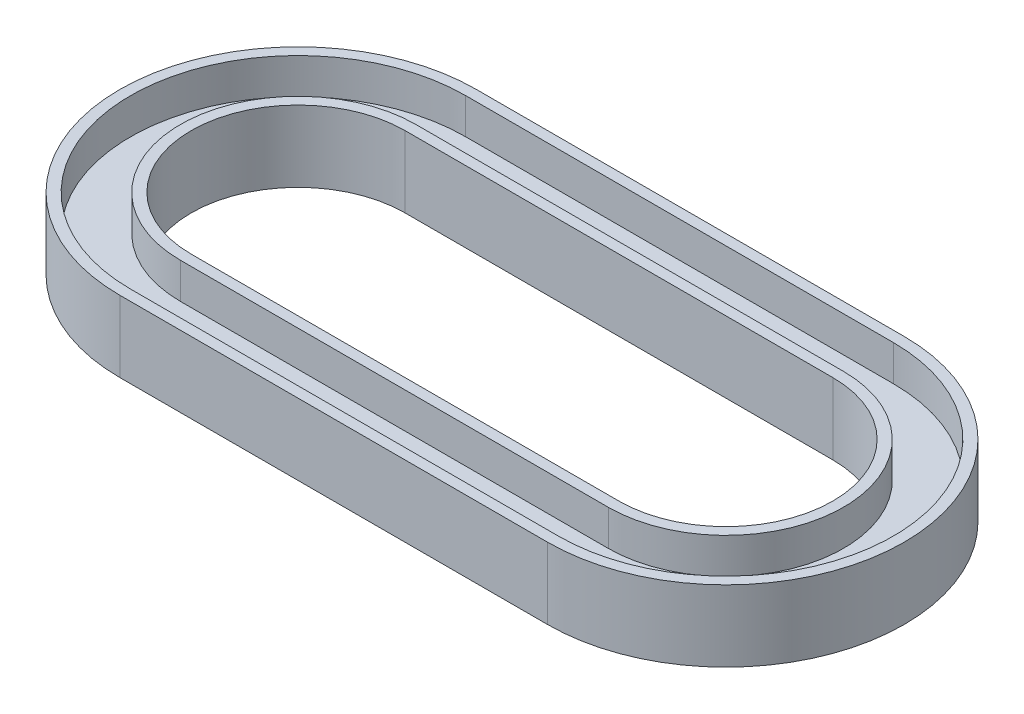
ISO-10303-21;
HEADER;
FILE_DESCRIPTION(('STEP AP214'),'2;1');
FILE_NAME('part.step','',(''),(''),'','','');
FILE_SCHEMA(('AUTOMOTIVE_DESIGN { 1 0 10303 214 1 1 1 1 }'));
ENDSEC;
DATA;
#1=APPLICATION_CONTEXT('core data for automotive mechanical design processes');
#2=APPLICATION_PROTOCOL_DEFINITION('international standard','automotive_design',2000,#1);
#3=PRODUCT_CONTEXT('',#1,'mechanical');
#4=PRODUCT('Part','Part','',(#3));
#5=PRODUCT_RELATED_PRODUCT_CATEGORY('part','',(#4));
#6=PRODUCT_DEFINITION_FORMATION('','',#4);
#7=PRODUCT_DEFINITION_CONTEXT('part definition',#1,'design');
#8=PRODUCT_DEFINITION('design','',#6,#7);
#9=PRODUCT_DEFINITION_SHAPE('','',#8);
#10=(LENGTH_UNIT() NAMED_UNIT(*) SI_UNIT(.MILLI.,.METRE.));
#11=(NAMED_UNIT(*) PLANE_ANGLE_UNIT() SI_UNIT($,.RADIAN.));
#12=(NAMED_UNIT(*) SI_UNIT($,.STERADIAN.) SOLID_ANGLE_UNIT());
#13=UNCERTAINTY_MEASURE_WITH_UNIT(LENGTH_MEASURE(1.E-05),#10,'distance_accuracy_value','');
#14=(GEOMETRIC_REPRESENTATION_CONTEXT(3) GLOBAL_UNCERTAINTY_ASSIGNED_CONTEXT((#13)) GLOBAL_UNIT_ASSIGNED_CONTEXT((#10,
#11,#12)) REPRESENTATION_CONTEXT('',''));
#15=CARTESIAN_POINT('',(0.,0.,0.));
#16=DIRECTION('',(0.,0.,1.));
#17=DIRECTION('',(1.,0.,0.));
#18=AXIS2_PLACEMENT_3D('',#15,#16,#17);
#19=CARTESIAN_POINT('',(-60.,10.,0.));
#20=DIRECTION('',(0.,1.,0.));
#21=DIRECTION('',(0.,0.,1.));
#22=AXIS2_PLACEMENT_3D('',#19,#20,#21);
#23=PLANE('',#22);
#24=CARTESIAN_POINT('',(60.,10.,0.));
#25=DIRECTION('',(0.,1.,0.));
#26=DIRECTION('',(0.,0.,1.));
#27=AXIS2_PLACEMENT_3D('',#24,#25,#26);
#28=CIRCLE('',#27,47.);
#29=CARTESIAN_POINT('',(60.,10.,-47.));
#30=VERTEX_POINT('',#29);
#31=CARTESIAN_POINT('',(60.,10.,47.));
#32=VERTEX_POINT('',#31);
#33=EDGE_CURVE('E178',#30,#32,#28,.F.);
#34=ORIENTED_EDGE('',*,*,#33,.F.);
#35=DIRECTION('',(-1.,0.,0.));
#36=VECTOR('',#35,1.);
#37=CARTESIAN_POINT('',(-60.,10.,-47.));
#38=LINE('',#37,#36);
#39=CARTESIAN_POINT('',(-60.,10.,-47.));
#40=VERTEX_POINT('',#39);
#41=EDGE_CURVE('E182',#30,#40,#38,.T.);
#42=ORIENTED_EDGE('',*,*,#41,.T.);
#43=CARTESIAN_POINT('',(-60.,10.,0.));
#44=DIRECTION('',(0.,1.,0.));
#45=DIRECTION('',(0.,0.,1.));
#46=AXIS2_PLACEMENT_3D('',#43,#44,#45);
#47=CIRCLE('',#46,47.);
#48=CARTESIAN_POINT('',(-60.,10.,47.));
#49=VERTEX_POINT('',#48);
#50=EDGE_CURVE('E220',#49,#40,#47,.F.);
#51=ORIENTED_EDGE('',*,*,#50,.F.);
#52=DIRECTION('',(-1.,0.,0.));
#53=VECTOR('',#52,1.);
#54=CARTESIAN_POINT('',(-60.,10.,47.));
#55=LINE('',#54,#53);
#56=EDGE_CURVE('E222',#32,#49,#55,.T.);
#57=ORIENTED_EDGE('',*,*,#56,.F.);
#58=EDGE_LOOP('',(#34,#42,#51,#57));
#59=FACE_BOUND('',#58,.T.);
#60=DIRECTION('',(-1.,0.,0.));
#61=VECTOR('',#60,1.);
#62=CARTESIAN_POINT('',(-60.,10.,-33.));
#63=LINE('',#62,#61);
#64=CARTESIAN_POINT('',(60.,10.,-33.));
#65=VERTEX_POINT('',#64);
#66=CARTESIAN_POINT('',(-60.,10.,-33.));
#67=VERTEX_POINT('',#66);
#68=EDGE_CURVE('E267',#65,#67,#63,.T.);
#69=ORIENTED_EDGE('',*,*,#68,.F.);
#70=CARTESIAN_POINT('',(60.,10.,0.));
#71=DIRECTION('',(0.,1.,0.));
#72=DIRECTION('',(0.,0.,1.));
#73=AXIS2_PLACEMENT_3D('',#70,#71,#72);
#74=CIRCLE('',#73,33.);
#75=CARTESIAN_POINT('',(60.,10.,33.));
#76=VERTEX_POINT('',#75);
#77=EDGE_CURVE('E258',#65,#76,#74,.F.);
#78=ORIENTED_EDGE('',*,*,#77,.T.);
#79=DIRECTION('',(-1.,0.,0.));
#80=VECTOR('',#79,1.);
#81=CARTESIAN_POINT('',(-60.,10.,33.));
#82=LINE('',#81,#80);
#83=CARTESIAN_POINT('',(-60.,10.,33.));
#84=VERTEX_POINT('',#83);
#85=EDGE_CURVE('E261',#76,#84,#82,.T.);
#86=ORIENTED_EDGE('',*,*,#85,.T.);
#87=CARTESIAN_POINT('',(-60.,10.,0.));
#88=DIRECTION('',(0.,1.,0.));
#89=DIRECTION('',(0.,0.,1.));
#90=AXIS2_PLACEMENT_3D('',#87,#88,#89);
#91=CIRCLE('',#90,33.);
#92=EDGE_CURVE('E264',#84,#67,#91,.F.);
#93=ORIENTED_EDGE('',*,*,#92,.T.);
#94=EDGE_LOOP('',(#69,#78,#86,#93));
#95=FACE_BOUND('',#94,.T.);
#96=ADVANCED_FACE('F59',(#59,#95),#23,.T.);
#97=CARTESIAN_POINT('',(-60.,0.,0.));
#98=DIRECTION('',(0.,1.,0.));
#99=DIRECTION('',(0.,0.,1.));
#100=AXIS2_PLACEMENT_3D('',#97,#98,#99);
#101=PLANE('',#100);
#102=CARTESIAN_POINT('',(-60.,0.,0.));
#103=DIRECTION('',(0.,1.,0.));
#104=DIRECTION('',(0.,0.,1.));
#105=AXIS2_PLACEMENT_3D('',#102,#103,#104);
#106=CIRCLE('',#105,30.);
#107=CARTESIAN_POINT('',(-60.,0.,-30.));
#108=VERTEX_POINT('',#107);
#109=CARTESIAN_POINT('',(-60.,0.,30.));
#110=VERTEX_POINT('',#109);
#111=EDGE_CURVE('E269',#108,#110,#106,.T.);
#112=ORIENTED_EDGE('',*,*,#111,.T.);
#113=DIRECTION('',(1.,0.,0.));
#114=VECTOR('',#113,1.);
#115=CARTESIAN_POINT('',(-60.,0.,30.));
#116=LINE('',#115,#114);
#117=CARTESIAN_POINT('',(60.,0.,30.));
#118=VERTEX_POINT('',#117);
#119=EDGE_CURVE('E272',#110,#118,#116,.T.);
#120=ORIENTED_EDGE('',*,*,#119,.T.);
#121=CARTESIAN_POINT('',(60.,0.,0.));
#122=DIRECTION('',(0.,1.,0.));
#123=DIRECTION('',(0.,0.,-1.));
#124=AXIS2_PLACEMENT_3D('',#121,#122,#123);
#125=CIRCLE('',#124,30.);
#126=CARTESIAN_POINT('',(60.,0.,-30.));
#127=VERTEX_POINT('',#126);
#128=EDGE_CURVE('E275',#118,#127,#125,.T.);
#129=ORIENTED_EDGE('',*,*,#128,.T.);
#130=DIRECTION('',(-1.,0.,0.));
#131=VECTOR('',#130,1.);
#132=CARTESIAN_POINT('',(-60.,0.,-30.));
#133=LINE('',#132,#131);
#134=EDGE_CURVE('E278',#127,#108,#133,.T.);
#135=ORIENTED_EDGE('',*,*,#134,.T.);
#136=EDGE_LOOP('',(#112,#120,#129,#135));
#137=FACE_BOUND('',#136,.T.);
#138=CARTESIAN_POINT('',(-60.,0.,0.));
#139=DIRECTION('',(0.,1.,0.));
#140=DIRECTION('',(0.,0.,1.));
#141=AXIS2_PLACEMENT_3D('',#138,#139,#140);
#142=CIRCLE('',#141,50.);
#143=CARTESIAN_POINT('',(-60.,0.,-50.));
#144=VERTEX_POINT('',#143);
#145=CARTESIAN_POINT('',(-60.,0.,50.));
#146=VERTEX_POINT('',#145);
#147=EDGE_CURVE('E291',#144,#146,#142,.T.);
#148=ORIENTED_EDGE('',*,*,#147,.F.);
#149=DIRECTION('',(-1.,0.,0.));
#150=VECTOR('',#149,1.);
#151=CARTESIAN_POINT('',(-60.,0.,-50.));
#152=LINE('',#151,#150);
#153=CARTESIAN_POINT('',(60.,0.,-50.));
#154=VERTEX_POINT('',#153);
#155=EDGE_CURVE('E298',#154,#144,#152,.T.);
#156=ORIENTED_EDGE('',*,*,#155,.F.);
#157=CARTESIAN_POINT('',(60.,0.,0.));
#158=DIRECTION('',(0.,1.,0.));
#159=DIRECTION('',(0.,0.,-1.));
#160=AXIS2_PLACEMENT_3D('',#157,#158,#159);
#161=CIRCLE('',#160,50.);
#162=CARTESIAN_POINT('',(60.,0.,50.));
#163=VERTEX_POINT('',#162);
#164=EDGE_CURVE('E296',#163,#154,#161,.T.);
#165=ORIENTED_EDGE('',*,*,#164,.F.);
#166=DIRECTION('',(1.,0.,0.));
#167=VECTOR('',#166,1.);
#168=CARTESIAN_POINT('',(-60.,0.,50.));
#169=LINE('',#168,#167);
#170=EDGE_CURVE('E294',#146,#163,#169,.T.);
#171=ORIENTED_EDGE('',*,*,#170,.F.);
#172=EDGE_LOOP('',(#148,#156,#165,#171));
#173=FACE_BOUND('',#172,.T.);
#174=ADVANCED_FACE('F315',(#137,#173),#101,.F.);
#175=CARTESIAN_POINT('',(-60.,10.,0.));
#176=DIRECTION('',(0.,-1.,0.));
#177=DIRECTION('',(0.,0.,-1.));
#178=AXIS2_PLACEMENT_3D('',#175,#176,#177);
#179=CYLINDRICAL_SURFACE('',#178,50.);
#180=ORIENTED_EDGE('',*,*,#147,.T.);
#181=DIRECTION('',(0.,-1.,0.));
#182=VECTOR('',#181,1.);
#183=CARTESIAN_POINT('',(-60.,10.,50.));
#184=LINE('',#183,#182);
#185=CARTESIAN_POINT('',(-60.,20.,50.));
#186=VERTEX_POINT('',#185);
#187=EDGE_CURVE('E12',#186,#146,#184,.T.);
#188=ORIENTED_EDGE('',*,*,#187,.F.);
#189=CARTESIAN_POINT('',(-60.,20.,0.));
#190=DIRECTION('',(0.,1.,0.));
#191=DIRECTION('',(0.,0.,1.));
#192=AXIS2_PLACEMENT_3D('',#189,#190,#191);
#193=CIRCLE('',#192,50.);
#194=CARTESIAN_POINT('',(-60.,20.,-50.));
#195=VERTEX_POINT('',#194);
#196=EDGE_CURVE('E205',#195,#186,#193,.T.);
#197=ORIENTED_EDGE('',*,*,#196,.F.);
#198=DIRECTION('',(0.,-1.,0.));
#199=VECTOR('',#198,1.);
#200=CARTESIAN_POINT('',(-60.,10.,-50.));
#201=LINE('',#200,#199);
#202=EDGE_CURVE('E300',#195,#144,#201,.T.);
#203=ORIENTED_EDGE('',*,*,#202,.T.);
#204=EDGE_LOOP('',(#180,#188,#197,#203));
#205=FACE_BOUND('',#204,.T.);
#206=ADVANCED_FACE('F61',(#205),#179,.T.);
#207=CARTESIAN_POINT('',(-60.,10.,50.));
#208=DIRECTION('',(0.,0.,-1.));
#209=DIRECTION('',(-1.,0.,0.));
#210=AXIS2_PLACEMENT_3D('',#207,#208,#209);
#211=PLANE('',#210);
#212=ORIENTED_EDGE('',*,*,#170,.T.);
#213=DIRECTION('',(0.,-1.,0.));
#214=VECTOR('',#213,1.);
#215=CARTESIAN_POINT('',(60.,10.,50.));
#216=LINE('',#215,#214);
#217=CARTESIAN_POINT('',(60.,20.,50.));
#218=VERTEX_POINT('',#217);
#219=EDGE_CURVE('E67',#218,#163,#216,.T.);
#220=ORIENTED_EDGE('',*,*,#219,.F.);
#221=DIRECTION('',(1.,0.,0.));
#222=VECTOR('',#221,1.);
#223=CARTESIAN_POINT('',(0.,20.,50.));
#224=LINE('',#223,#222);
#225=EDGE_CURVE('E208',#186,#218,#224,.T.);
#226=ORIENTED_EDGE('',*,*,#225,.F.);
#227=ORIENTED_EDGE('',*,*,#187,.T.);
#228=EDGE_LOOP('',(#212,#220,#226,#227));
#229=FACE_BOUND('',#228,.T.);
#230=ADVANCED_FACE('F321',(#229),#211,.F.);
#231=CARTESIAN_POINT('',(60.,10.,0.));
#232=DIRECTION('',(0.,-1.,0.));
#233=DIRECTION('',(0.,0.,-1.));
#234=AXIS2_PLACEMENT_3D('',#231,#232,#233);
#235=CYLINDRICAL_SURFACE('',#234,50.);
#236=ORIENTED_EDGE('',*,*,#164,.T.);
#237=DIRECTION('',(0.,-1.,0.));
#238=VECTOR('',#237,1.);
#239=CARTESIAN_POINT('',(60.,10.,-50.));
#240=LINE('',#239,#238);
#241=CARTESIAN_POINT('',(60.,20.,-50.));
#242=VERTEX_POINT('',#241);
#243=EDGE_CURVE('E303',#242,#154,#240,.T.);
#244=ORIENTED_EDGE('',*,*,#243,.F.);
#245=CARTESIAN_POINT('',(60.,20.,0.));
#246=DIRECTION('',(0.,1.,0.));
#247=DIRECTION('',(0.,0.,1.));
#248=AXIS2_PLACEMENT_3D('',#245,#246,#247);
#249=CIRCLE('',#248,50.);
#250=EDGE_CURVE('E211',#218,#242,#249,.T.);
#251=ORIENTED_EDGE('',*,*,#250,.F.);
#252=ORIENTED_EDGE('',*,*,#219,.T.);
#253=EDGE_LOOP('',(#236,#244,#251,#252));
#254=FACE_BOUND('',#253,.T.);
#255=ADVANCED_FACE('F309',(#254),#235,.T.);
#256=CARTESIAN_POINT('',(-60.,10.,-50.));
#257=DIRECTION('',(0.,0.,1.));
#258=DIRECTION('',(1.,0.,0.));
#259=AXIS2_PLACEMENT_3D('',#256,#257,#258);
#260=PLANE('',#259);
#261=ORIENTED_EDGE('',*,*,#155,.T.);
#262=ORIENTED_EDGE('',*,*,#202,.F.);
#263=DIRECTION('',(1.,0.,0.));
#264=VECTOR('',#263,1.);
#265=CARTESIAN_POINT('',(0.,20.,-50.));
#266=LINE('',#265,#264);
#267=EDGE_CURVE('E202',#195,#242,#266,.T.);
#268=ORIENTED_EDGE('',*,*,#267,.T.);
#269=ORIENTED_EDGE('',*,*,#243,.T.);
#270=EDGE_LOOP('',(#261,#262,#268,#269));
#271=FACE_BOUND('',#270,.T.);
#272=ADVANCED_FACE('F317',(#271),#260,.F.);
#273=CARTESIAN_POINT('',(-60.,10.,0.));
#274=DIRECTION('',(0.,-1.,0.));
#275=DIRECTION('',(0.,0.,-1.));
#276=AXIS2_PLACEMENT_3D('',#273,#274,#275);
#277=CYLINDRICAL_SURFACE('',#276,30.);
#278=ORIENTED_EDGE('',*,*,#111,.F.);
#279=DIRECTION('',(0.,-1.,0.));
#280=VECTOR('',#279,1.);
#281=CARTESIAN_POINT('',(-60.,10.,-30.));
#282=LINE('',#281,#280);
#283=CARTESIAN_POINT('',(-60.,20.,-30.));
#284=VERTEX_POINT('',#283);
#285=EDGE_CURVE('E281',#284,#108,#282,.T.);
#286=ORIENTED_EDGE('',*,*,#285,.F.);
#287=CARTESIAN_POINT('',(-60.,20.,0.));
#288=DIRECTION('',(0.,1.,0.));
#289=DIRECTION('',(0.,0.,1.));
#290=AXIS2_PLACEMENT_3D('',#287,#288,#289);
#291=CIRCLE('',#290,30.);
#292=CARTESIAN_POINT('',(-60.,20.,30.));
#293=VERTEX_POINT('',#292);
#294=EDGE_CURVE('E225',#284,#293,#291,.T.);
#295=ORIENTED_EDGE('',*,*,#294,.T.);
#296=DIRECTION('',(0.,-1.,0.));
#297=VECTOR('',#296,1.);
#298=CARTESIAN_POINT('',(-60.,10.,30.));
#299=LINE('',#298,#297);
#300=EDGE_CURVE('E288',#293,#110,#299,.T.);
#301=ORIENTED_EDGE('',*,*,#300,.T.);
#302=EDGE_LOOP('',(#278,#286,#295,#301));
#303=FACE_BOUND('',#302,.T.);
#304=ADVANCED_FACE('F338',(#303),#277,.F.);
#305=CARTESIAN_POINT('',(-60.,10.,30.));
#306=DIRECTION('',(0.,0.,-1.));
#307=DIRECTION('',(-1.,0.,0.));
#308=AXIS2_PLACEMENT_3D('',#305,#306,#307);
#309=PLANE('',#308);
#310=ORIENTED_EDGE('',*,*,#119,.F.);
#311=ORIENTED_EDGE('',*,*,#300,.F.);
#312=DIRECTION('',(1.,0.,0.));
#313=VECTOR('',#312,1.);
#314=CARTESIAN_POINT('',(0.,20.,30.));
#315=LINE('',#314,#313);
#316=CARTESIAN_POINT('',(60.,20.,30.));
#317=VERTEX_POINT('',#316);
#318=EDGE_CURVE('E234',#293,#317,#315,.T.);
#319=ORIENTED_EDGE('',*,*,#318,.T.);
#320=DIRECTION('',(0.,-1.,0.));
#321=VECTOR('',#320,1.);
#322=CARTESIAN_POINT('',(60.,10.,30.));
#323=LINE('',#322,#321);
#324=EDGE_CURVE('E286',#317,#118,#323,.T.);
#325=ORIENTED_EDGE('',*,*,#324,.T.);
#326=EDGE_LOOP('',(#310,#311,#319,#325));
#327=FACE_BOUND('',#326,.T.);
#328=ADVANCED_FACE('F345',(#327),#309,.T.);
#329=CARTESIAN_POINT('',(60.,10.,0.));
#330=DIRECTION('',(0.,-1.,0.));
#331=DIRECTION('',(0.,0.,-1.));
#332=AXIS2_PLACEMENT_3D('',#329,#330,#331);
#333=CYLINDRICAL_SURFACE('',#332,30.);
#334=ORIENTED_EDGE('',*,*,#128,.F.);
#335=ORIENTED_EDGE('',*,*,#324,.F.);
#336=CARTESIAN_POINT('',(60.,20.,0.));
#337=DIRECTION('',(0.,1.,0.));
#338=DIRECTION('',(0.,0.,1.));
#339=AXIS2_PLACEMENT_3D('',#336,#337,#338);
#340=CIRCLE('',#339,30.);
#341=CARTESIAN_POINT('',(60.,20.,-30.));
#342=VERTEX_POINT('',#341);
#343=EDGE_CURVE('E231',#317,#342,#340,.T.);
#344=ORIENTED_EDGE('',*,*,#343,.T.);
#345=DIRECTION('',(0.,-1.,0.));
#346=VECTOR('',#345,1.);
#347=CARTESIAN_POINT('',(60.,10.,-30.));
#348=LINE('',#347,#346);
#349=EDGE_CURVE('E284',#342,#127,#348,.T.);
#350=ORIENTED_EDGE('',*,*,#349,.T.);
#351=EDGE_LOOP('',(#334,#335,#344,#350));
#352=FACE_BOUND('',#351,.T.);
#353=ADVANCED_FACE('F350',(#352),#333,.F.);
#354=CARTESIAN_POINT('',(-60.,10.,-30.));
#355=DIRECTION('',(0.,0.,1.));
#356=DIRECTION('',(1.,0.,0.));
#357=AXIS2_PLACEMENT_3D('',#354,#355,#356);
#358=PLANE('',#357);
#359=ORIENTED_EDGE('',*,*,#134,.F.);
#360=ORIENTED_EDGE('',*,*,#349,.F.);
#361=DIRECTION('',(1.,0.,0.));
#362=VECTOR('',#361,1.);
#363=CARTESIAN_POINT('',(0.,20.,-30.));
#364=LINE('',#363,#362);
#365=EDGE_CURVE('E228',#284,#342,#364,.T.);
#366=ORIENTED_EDGE('',*,*,#365,.F.);
#367=ORIENTED_EDGE('',*,*,#285,.T.);
#368=EDGE_LOOP('',(#359,#360,#366,#367));
#369=FACE_BOUND('',#368,.T.);
#370=ADVANCED_FACE('F355',(#369),#358,.T.);
#371=CARTESIAN_POINT('',(0.,20.,-33.));
#372=DIRECTION('',(0.,0.,-1.));
#373=DIRECTION('',(-1.,0.,0.));
#374=AXIS2_PLACEMENT_3D('',#371,#372,#373);
#375=PLANE('',#374);
#376=DIRECTION('',(0.,-1.,0.));
#377=VECTOR('',#376,1.);
#378=CARTESIAN_POINT('',(60.,20.,-33.));
#379=LINE('',#378,#377);
#380=CARTESIAN_POINT('',(60.,20.,-33.));
#381=VERTEX_POINT('',#380);
#382=EDGE_CURVE('E248',#381,#65,#379,.T.);
#383=ORIENTED_EDGE('',*,*,#382,.T.);
#384=ORIENTED_EDGE('',*,*,#68,.T.);
#385=DIRECTION('',(0.,-1.,0.));
#386=VECTOR('',#385,1.);
#387=CARTESIAN_POINT('',(-60.,20.,-33.));
#388=LINE('',#387,#386);
#389=CARTESIAN_POINT('',(-60.,20.,-33.));
#390=VERTEX_POINT('',#389);
#391=EDGE_CURVE('E255',#390,#67,#388,.T.);
#392=ORIENTED_EDGE('',*,*,#391,.F.);
#393=DIRECTION('',(1.,0.,0.));
#394=VECTOR('',#393,1.);
#395=CARTESIAN_POINT('',(0.,20.,-33.));
#396=LINE('',#395,#394);
#397=EDGE_CURVE('E237',#390,#381,#396,.T.);
#398=ORIENTED_EDGE('',*,*,#397,.T.);
#399=EDGE_LOOP('',(#383,#384,#392,#398));
#400=FACE_BOUND('',#399,.T.);
#401=ADVANCED_FACE('F372',(#400),#375,.T.);
#402=CARTESIAN_POINT('',(-60.,20.,0.));
#403=DIRECTION('',(0.,-1.,0.));
#404=DIRECTION('',(0.,0.,-1.));
#405=AXIS2_PLACEMENT_3D('',#402,#403,#404);
#406=CYLINDRICAL_SURFACE('',#405,33.);
#407=ORIENTED_EDGE('',*,*,#92,.F.);
#408=DIRECTION('',(0.,-1.,0.));
#409=VECTOR('',#408,1.);
#410=CARTESIAN_POINT('',(-60.,20.,33.));
#411=LINE('',#410,#409);
#412=CARTESIAN_POINT('',(-60.,20.,33.));
#413=VERTEX_POINT('',#412);
#414=EDGE_CURVE('E252',#413,#84,#411,.T.);
#415=ORIENTED_EDGE('',*,*,#414,.F.);
#416=CARTESIAN_POINT('',(-60.,20.,0.));
#417=DIRECTION('',(0.,1.,0.));
#418=DIRECTION('',(0.,0.,1.));
#419=AXIS2_PLACEMENT_3D('',#416,#417,#418);
#420=CIRCLE('',#419,33.);
#421=EDGE_CURVE('E240',#390,#413,#420,.T.);
#422=ORIENTED_EDGE('',*,*,#421,.F.);
#423=ORIENTED_EDGE('',*,*,#391,.T.);
#424=EDGE_LOOP('',(#407,#415,#422,#423));
#425=FACE_BOUND('',#424,.T.);
#426=ADVANCED_FACE('F375',(#425),#406,.T.);
#427=CARTESIAN_POINT('',(0.,20.,33.));
#428=DIRECTION('',(0.,0.,-1.));
#429=DIRECTION('',(-1.,0.,0.));
#430=AXIS2_PLACEMENT_3D('',#427,#428,#429);
#431=PLANE('',#430);
#432=ORIENTED_EDGE('',*,*,#85,.F.);
#433=DIRECTION('',(0.,-1.,0.));
#434=VECTOR('',#433,1.);
#435=CARTESIAN_POINT('',(60.,20.,33.));
#436=LINE('',#435,#434);
#437=CARTESIAN_POINT('',(60.,20.,33.));
#438=VERTEX_POINT('',#437);
#439=EDGE_CURVE('E82',#438,#76,#436,.T.);
#440=ORIENTED_EDGE('',*,*,#439,.F.);
#441=DIRECTION('',(1.,0.,0.));
#442=VECTOR('',#441,1.);
#443=CARTESIAN_POINT('',(0.,20.,33.));
#444=LINE('',#443,#442);
#445=EDGE_CURVE('E243',#413,#438,#444,.T.);
#446=ORIENTED_EDGE('',*,*,#445,.F.);
#447=ORIENTED_EDGE('',*,*,#414,.T.);
#448=EDGE_LOOP('',(#432,#440,#446,#447));
#449=FACE_BOUND('',#448,.T.);
#450=ADVANCED_FACE('F377',(#449),#431,.F.);
#451=CARTESIAN_POINT('',(60.,20.,0.));
#452=DIRECTION('',(0.,-1.,0.));
#453=DIRECTION('',(0.,0.,-1.));
#454=AXIS2_PLACEMENT_3D('',#451,#452,#453);
#455=CYLINDRICAL_SURFACE('',#454,33.);
#456=ORIENTED_EDGE('',*,*,#77,.F.);
#457=ORIENTED_EDGE('',*,*,#382,.F.);
#458=CARTESIAN_POINT('',(60.,20.,0.));
#459=DIRECTION('',(0.,1.,0.));
#460=DIRECTION('',(0.,0.,1.));
#461=AXIS2_PLACEMENT_3D('',#458,#459,#460);
#462=CIRCLE('',#461,33.);
#463=EDGE_CURVE('E246',#438,#381,#462,.T.);
#464=ORIENTED_EDGE('',*,*,#463,.F.);
#465=ORIENTED_EDGE('',*,*,#439,.T.);
#466=EDGE_LOOP('',(#456,#457,#464,#465));
#467=FACE_BOUND('',#466,.T.);
#468=ADVANCED_FACE('F365',(#467),#455,.T.);
#469=CARTESIAN_POINT('',(0.,20.,0.));
#470=DIRECTION('',(0.,1.,0.));
#471=DIRECTION('',(0.,0.,1.));
#472=AXIS2_PLACEMENT_3D('',#469,#470,#471);
#473=PLANE('',#472);
#474=ORIENTED_EDGE('',*,*,#294,.F.);
#475=ORIENTED_EDGE('',*,*,#365,.T.);
#476=ORIENTED_EDGE('',*,*,#343,.F.);
#477=ORIENTED_EDGE('',*,*,#318,.F.);
#478=EDGE_LOOP('',(#474,#475,#476,#477));
#479=FACE_BOUND('',#478,.T.);
#480=ORIENTED_EDGE('',*,*,#397,.F.);
#481=ORIENTED_EDGE('',*,*,#421,.T.);
#482=ORIENTED_EDGE('',*,*,#445,.T.);
#483=ORIENTED_EDGE('',*,*,#463,.T.);
#484=EDGE_LOOP('',(#480,#481,#482,#483));
#485=FACE_BOUND('',#484,.T.);
#486=ADVANCED_FACE('F361',(#479,#485),#473,.T.);
#487=CARTESIAN_POINT('',(60.,20.,0.));
#488=DIRECTION('',(0.,-1.,0.));
#489=DIRECTION('',(0.,0.,-1.));
#490=AXIS2_PLACEMENT_3D('',#487,#488,#489);
#491=CYLINDRICAL_SURFACE('',#490,47.);
#492=DIRECTION('',(0.,-1.,0.));
#493=VECTOR('',#492,1.);
#494=CARTESIAN_POINT('',(60.,20.,-47.));
#495=LINE('',#494,#493);
#496=CARTESIAN_POINT('',(60.,20.,-47.));
#497=VERTEX_POINT('',#496);
#498=EDGE_CURVE('E214',#497,#30,#495,.T.);
#499=ORIENTED_EDGE('',*,*,#498,.T.);
#500=ORIENTED_EDGE('',*,*,#33,.T.);
#501=DIRECTION('',(0.,-1.,0.));
#502=VECTOR('',#501,1.);
#503=CARTESIAN_POINT('',(60.,20.,47.));
#504=LINE('',#503,#502);
#505=CARTESIAN_POINT('',(60.,20.,47.));
#506=VERTEX_POINT('',#505);
#507=EDGE_CURVE('E172',#506,#32,#504,.T.);
#508=ORIENTED_EDGE('',*,*,#507,.F.);
#509=CARTESIAN_POINT('',(60.,20.,0.));
#510=DIRECTION('',(0.,1.,0.));
#511=DIRECTION('',(0.,0.,1.));
#512=AXIS2_PLACEMENT_3D('',#509,#510,#511);
#513=CIRCLE('',#512,47.);
#514=EDGE_CURVE('E176',#506,#497,#513,.T.);
#515=ORIENTED_EDGE('',*,*,#514,.T.);
#516=EDGE_LOOP('',(#499,#500,#508,#515));
#517=FACE_BOUND('',#516,.T.);
#518=ADVANCED_FACE('F175',(#517),#491,.F.);
#519=CARTESIAN_POINT('',(0.,20.,47.));
#520=DIRECTION('',(0.,0.,-1.));
#521=DIRECTION('',(-1.,0.,0.));
#522=AXIS2_PLACEMENT_3D('',#519,#520,#521);
#523=PLANE('',#522);
#524=ORIENTED_EDGE('',*,*,#507,.T.);
#525=ORIENTED_EDGE('',*,*,#56,.T.);
#526=DIRECTION('',(0.,-1.,0.));
#527=VECTOR('',#526,1.);
#528=CARTESIAN_POINT('',(-60.,20.,47.));
#529=LINE('',#528,#527);
#530=CARTESIAN_POINT('',(-60.,20.,47.));
#531=VERTEX_POINT('',#530);
#532=EDGE_CURVE('E183',#531,#49,#529,.T.);
#533=ORIENTED_EDGE('',*,*,#532,.F.);
#534=DIRECTION('',(1.,0.,0.));
#535=VECTOR('',#534,1.);
#536=CARTESIAN_POINT('',(0.,20.,47.));
#537=LINE('',#536,#535);
#538=EDGE_CURVE('E190',#531,#506,#537,.T.);
#539=ORIENTED_EDGE('',*,*,#538,.T.);
#540=EDGE_LOOP('',(#524,#525,#533,#539));
#541=FACE_BOUND('',#540,.T.);
#542=ADVANCED_FACE('F195',(#541),#523,.T.);
#543=CARTESIAN_POINT('',(-60.,20.,0.));
#544=DIRECTION('',(0.,-1.,0.));
#545=DIRECTION('',(0.,0.,-1.));
#546=AXIS2_PLACEMENT_3D('',#543,#544,#545);
#547=CYLINDRICAL_SURFACE('',#546,47.);
#548=ORIENTED_EDGE('',*,*,#532,.T.);
#549=ORIENTED_EDGE('',*,*,#50,.T.);
#550=DIRECTION('',(0.,-1.,0.));
#551=VECTOR('',#550,1.);
#552=CARTESIAN_POINT('',(-60.,20.,-47.));
#553=LINE('',#552,#551);
#554=CARTESIAN_POINT('',(-60.,20.,-47.));
#555=VERTEX_POINT('',#554);
#556=EDGE_CURVE('E74',#555,#40,#553,.T.);
#557=ORIENTED_EDGE('',*,*,#556,.F.);
#558=CARTESIAN_POINT('',(-60.,20.,0.));
#559=DIRECTION('',(0.,1.,0.));
#560=DIRECTION('',(0.,0.,1.));
#561=AXIS2_PLACEMENT_3D('',#558,#559,#560);
#562=CIRCLE('',#561,47.);
#563=EDGE_CURVE('E197',#555,#531,#562,.T.);
#564=ORIENTED_EDGE('',*,*,#563,.T.);
#565=EDGE_LOOP('',(#548,#549,#557,#564));
#566=FACE_BOUND('',#565,.T.);
#567=ADVANCED_FACE('F439',(#566),#547,.F.);
#568=CARTESIAN_POINT('',(0.,20.,-47.));
#569=DIRECTION('',(0.,0.,-1.));
#570=DIRECTION('',(-1.,0.,0.));
#571=AXIS2_PLACEMENT_3D('',#568,#569,#570);
#572=PLANE('',#571);
#573=ORIENTED_EDGE('',*,*,#41,.F.);
#574=ORIENTED_EDGE('',*,*,#498,.F.);
#575=DIRECTION('',(1.,0.,0.));
#576=VECTOR('',#575,1.);
#577=CARTESIAN_POINT('',(0.,20.,-47.));
#578=LINE('',#577,#576);
#579=EDGE_CURVE('E192',#555,#497,#578,.T.);
#580=ORIENTED_EDGE('',*,*,#579,.F.);
#581=ORIENTED_EDGE('',*,*,#556,.T.);
#582=EDGE_LOOP('',(#573,#574,#580,#581));
#583=FACE_BOUND('',#582,.T.);
#584=ADVANCED_FACE('F448',(#583),#572,.F.);
#585=CARTESIAN_POINT('',(0.,20.,0.));
#586=DIRECTION('',(0.,1.,0.));
#587=DIRECTION('',(0.,0.,1.));
#588=AXIS2_PLACEMENT_3D('',#585,#586,#587);
#589=PLANE('',#588);
#590=ORIENTED_EDGE('',*,*,#514,.F.);
#591=ORIENTED_EDGE('',*,*,#538,.F.);
#592=ORIENTED_EDGE('',*,*,#563,.F.);
#593=ORIENTED_EDGE('',*,*,#579,.T.);
#594=EDGE_LOOP('',(#590,#591,#592,#593));
#595=FACE_BOUND('',#594,.T.);
#596=ORIENTED_EDGE('',*,*,#267,.F.);
#597=ORIENTED_EDGE('',*,*,#196,.T.);
#598=ORIENTED_EDGE('',*,*,#225,.T.);
#599=ORIENTED_EDGE('',*,*,#250,.T.);
#600=EDGE_LOOP('',(#596,#597,#598,#599));
#601=FACE_BOUND('',#600,.T.);
#602=ADVANCED_FACE('F187',(#595,#601),#589,.T.);
#603=CLOSED_SHELL('',(#96,#174,#206,#230,#255,#272,#304,#328,#353,#370,#401,#426,#450,#468,#486,
#518,#542,#567,#584,#602));
#604=MANIFOLD_SOLID_BREP('B2',#603);
#605=ADVANCED_BREP_SHAPE_REPRESENTATION('',(#18,#604),#14);
#606=SHAPE_DEFINITION_REPRESENTATION(#9,#605);
ENDSEC;
END-ISO-10303-21;
